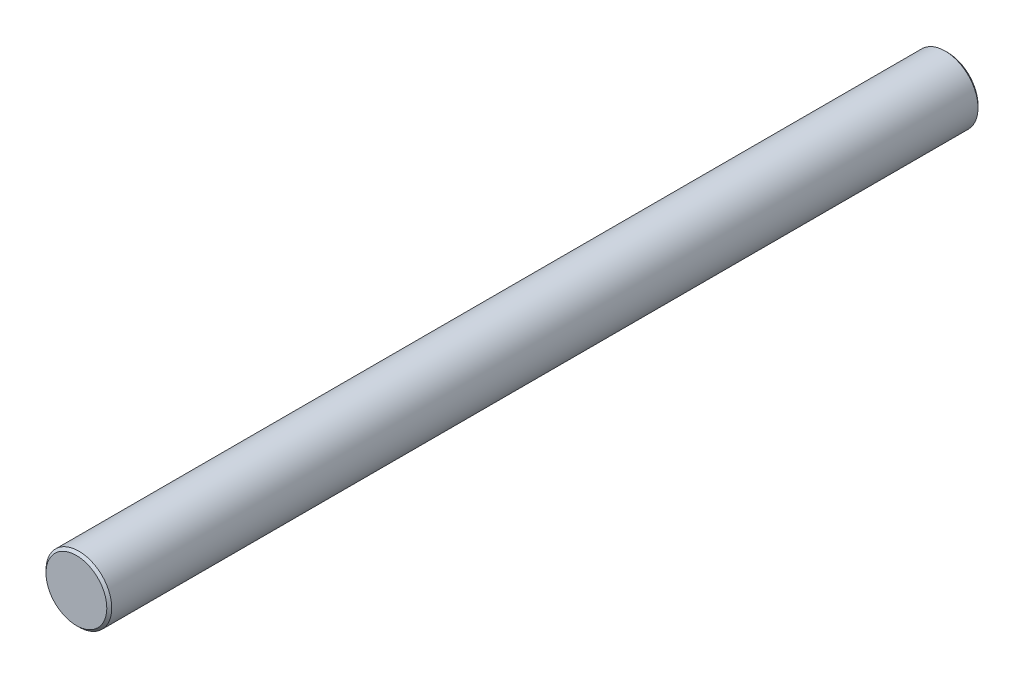
ISO-10303-21;
HEADER;
FILE_DESCRIPTION(('STEP AP214'),'2;1');
FILE_NAME('part.step','',(''),(''),'','','');
FILE_SCHEMA(('AUTOMOTIVE_DESIGN { 1 0 10303 214 1 1 1 1 }'));
ENDSEC;
DATA;
#1=APPLICATION_CONTEXT('core data for automotive mechanical design processes');
#2=APPLICATION_PROTOCOL_DEFINITION('international standard','automotive_design',2000,#1);
#3=PRODUCT_CONTEXT('',#1,'mechanical');
#4=PRODUCT('Part','Part','',(#3));
#5=PRODUCT_RELATED_PRODUCT_CATEGORY('part','',(#4));
#6=PRODUCT_DEFINITION_FORMATION('','',#4);
#7=PRODUCT_DEFINITION_CONTEXT('part definition',#1,'design');
#8=PRODUCT_DEFINITION('design','',#6,#7);
#9=PRODUCT_DEFINITION_SHAPE('','',#8);
#10=(LENGTH_UNIT() NAMED_UNIT(*) SI_UNIT(.MILLI.,.METRE.));
#11=(NAMED_UNIT(*) PLANE_ANGLE_UNIT() SI_UNIT($,.RADIAN.));
#12=(NAMED_UNIT(*) SI_UNIT($,.STERADIAN.) SOLID_ANGLE_UNIT());
#13=UNCERTAINTY_MEASURE_WITH_UNIT(LENGTH_MEASURE(1.E-05),#10,'distance_accuracy_value','');
#14=(GEOMETRIC_REPRESENTATION_CONTEXT(3) GLOBAL_UNCERTAINTY_ASSIGNED_CONTEXT((#13)) GLOBAL_UNIT_ASSIGNED_CONTEXT((#10,
#11,#12)) REPRESENTATION_CONTEXT('',''));
#15=CARTESIAN_POINT('',(0.,0.,0.));
#16=DIRECTION('',(0.,0.,1.));
#17=DIRECTION('',(1.,0.,0.));
#18=AXIS2_PLACEMENT_3D('',#15,#16,#17);
#19=CARTESIAN_POINT('',(0.,9.25,0.));
#20=DIRECTION('',(0.,0.,-1.));
#21=DIRECTION('',(0.,1.,0.));
#22=AXIS2_PLACEMENT_3D('',#19,#20,#21);
#23=PLANE('',#22);
#24=CARTESIAN_POINT('',(0.,0.,0.));
#25=DIRECTION('',(0.,0.,-1.));
#26=DIRECTION('',(0.,1.,0.));
#27=AXIS2_PLACEMENT_3D('',#24,#25,#26);
#28=CIRCLE('',#27,18.5);
#29=CARTESIAN_POINT('',(0.,18.5,0.));
#30=VERTEX_POINT('',#29);
#31=EDGE_CURVE('E9',#30,#30,#28,.T.);
#32=ORIENTED_EDGE('',*,*,#31,.T.);
#33=EDGE_LOOP('',(#32));
#34=FACE_BOUND('',#33,.T.);
#35=CARTESIAN_POINT('',(0.,0.,0.));
#36=DIRECTION('',(0.,0.,1.));
#37=DIRECTION('',(-1.,0.,0.));
#38=AXIS2_PLACEMENT_3D('',#35,#36,#37);
#39=CIRCLE('',#38,6.);
#40=CARTESIAN_POINT('',(-6.,0.,0.));
#41=VERTEX_POINT('',#40);
#42=EDGE_CURVE('E52',#41,#41,#39,.T.);
#43=ORIENTED_EDGE('',*,*,#42,.T.);
#44=EDGE_LOOP('',(#43));
#45=FACE_BOUND('',#44,.T.);
#46=ADVANCED_FACE('F15',(#34,#45),#23,.T.);
#47=CARTESIAN_POINT('',(0.,0.,0.75));
#48=DIRECTION('',(0.,0.,1.));
#49=DIRECTION('',(0.,1.,0.));
#50=AXIS2_PLACEMENT_3D('',#47,#48,#49);
#51=CONICAL_SURFACE('',#50,19.25,0.785398163397448);
#52=CARTESIAN_POINT('',(0.,0.,1.5));
#53=DIRECTION('',(0.,0.,-1.));
#54=DIRECTION('',(0.,1.,0.));
#55=AXIS2_PLACEMENT_3D('',#52,#53,#54);
#56=CIRCLE('',#55,20.);
#57=CARTESIAN_POINT('',(0.,20.,1.5));
#58=VERTEX_POINT('',#57);
#59=EDGE_CURVE('E25',#58,#58,#56,.T.);
#60=ORIENTED_EDGE('',*,*,#59,.T.);
#61=EDGE_LOOP('',(#60));
#62=FACE_BOUND('',#61,.T.);
#63=ORIENTED_EDGE('',*,*,#31,.F.);
#64=EDGE_LOOP('',(#63));
#65=FACE_BOUND('',#64,.T.);
#66=ADVANCED_FACE('F121',(#62,#65),#51,.T.);
#67=CARTESIAN_POINT('',(0.,0.,265.));
#68=DIRECTION('',(0.,0.,1.));
#69=DIRECTION('',(0.,1.,0.));
#70=AXIS2_PLACEMENT_3D('',#67,#68,#69);
#71=CYLINDRICAL_SURFACE('',#70,20.);
#72=CARTESIAN_POINT('',(0.,0.,528.5));
#73=DIRECTION('',(0.,0.,-1.));
#74=DIRECTION('',(0.,1.,0.));
#75=AXIS2_PLACEMENT_3D('',#72,#73,#74);
#76=CIRCLE('',#75,20.);
#77=CARTESIAN_POINT('',(0.,20.,528.5));
#78=VERTEX_POINT('',#77);
#79=EDGE_CURVE('E19',#78,#78,#76,.T.);
#80=ORIENTED_EDGE('',*,*,#79,.T.);
#81=EDGE_LOOP('',(#80));
#82=FACE_BOUND('',#81,.T.);
#83=ORIENTED_EDGE('',*,*,#59,.F.);
#84=EDGE_LOOP('',(#83));
#85=FACE_BOUND('',#84,.T.);
#86=CARTESIAN_POINT('',(0.,0.,6.5));
#87=DIRECTION('',(0.,0.,-1.));
#88=DIRECTION('',(0.,1.,0.));
#89=AXIS2_PLACEMENT_3D('',#86,#87,#88);
#90=CIRCLE('',#89,20.);
#91=CARTESIAN_POINT('',(10.5356537528527,-17.,6.5));
#92=VERTEX_POINT('',#91);
#93=CARTESIAN_POINT('',(-10.5356537528527,-17.,6.5));
#94=VERTEX_POINT('',#93);
#95=EDGE_CURVE('E69',#92,#94,#90,.T.);
#96=ORIENTED_EDGE('',*,*,#95,.T.);
#97=DIRECTION('',(0.,0.,1.));
#98=VECTOR('',#97,1.);
#99=CARTESIAN_POINT('',(-10.5356537528527,-17.,8.25));
#100=LINE('',#99,#98);
#101=CARTESIAN_POINT('',(-10.5356537528527,-17.,10.));
#102=VERTEX_POINT('',#101);
#103=EDGE_CURVE('E62',#94,#102,#100,.T.);
#104=ORIENTED_EDGE('',*,*,#103,.T.);
#105=CARTESIAN_POINT('',(0.,0.,10.));
#106=DIRECTION('',(0.,0.,1.));
#107=DIRECTION('',(0.,1.,0.));
#108=AXIS2_PLACEMENT_3D('',#105,#106,#107);
#109=CIRCLE('',#108,20.);
#110=CARTESIAN_POINT('',(10.5356537528527,-17.,10.));
#111=VERTEX_POINT('',#110);
#112=EDGE_CURVE('E75',#102,#111,#109,.T.);
#113=ORIENTED_EDGE('',*,*,#112,.T.);
#114=DIRECTION('',(0.,0.,-1.));
#115=VECTOR('',#114,1.);
#116=CARTESIAN_POINT('',(10.5356537528527,-17.,8.25));
#117=LINE('',#116,#115);
#118=EDGE_CURVE('E60',#111,#92,#117,.T.);
#119=ORIENTED_EDGE('',*,*,#118,.T.);
#120=EDGE_LOOP('',(#96,#104,#113,#119));
#121=FACE_BOUND('',#120,.T.);
#122=ADVANCED_FACE('F17',(#82,#85,#121),#71,.T.);
#123=CARTESIAN_POINT('',(0.,0.,529.25));
#124=DIRECTION('',(0.,0.,-1.));
#125=DIRECTION('',(0.,1.,0.));
#126=AXIS2_PLACEMENT_3D('',#123,#124,#125);
#127=CONICAL_SURFACE('',#126,19.25,0.785398163397448);
#128=CARTESIAN_POINT('',(0.,0.,530.));
#129=DIRECTION('',(0.,0.,-1.));
#130=DIRECTION('',(0.,1.,0.));
#131=AXIS2_PLACEMENT_3D('',#128,#129,#130);
#132=CIRCLE('',#131,18.5);
#133=CARTESIAN_POINT('',(0.,18.5,530.));
#134=VERTEX_POINT('',#133);
#135=EDGE_CURVE('E44',#134,#134,#132,.T.);
#136=ORIENTED_EDGE('',*,*,#135,.T.);
#137=EDGE_LOOP('',(#136));
#138=FACE_BOUND('',#137,.T.);
#139=ORIENTED_EDGE('',*,*,#79,.F.);
#140=EDGE_LOOP('',(#139));
#141=FACE_BOUND('',#140,.T.);
#142=ADVANCED_FACE('F116',(#138,#141),#127,.T.);
#143=CARTESIAN_POINT('',(0.,9.25,530.));
#144=DIRECTION('',(0.,0.,1.));
#145=DIRECTION('',(0.,-1.,0.));
#146=AXIS2_PLACEMENT_3D('',#143,#144,#145);
#147=PLANE('',#146);
#148=ORIENTED_EDGE('',*,*,#135,.F.);
#149=EDGE_LOOP('',(#148));
#150=FACE_BOUND('',#149,.T.);
#151=ADVANCED_FACE('F110',(#150),#147,.T.);
#152=CARTESIAN_POINT('',(0.,0.,26.4586213285198));
#153=DIRECTION('',(0.,0.,-1.));
#154=DIRECTION('',(-1.,0.,0.));
#155=AXIS2_PLACEMENT_3D('',#152,#153,#154);
#156=CONICAL_SURFACE('',#155,2.52640625,1.0471975511966);
#157=CARTESIAN_POINT('',(0.,0.,25.));
#158=DIRECTION('',(0.,0.,1.));
#159=DIRECTION('',(-1.,0.,0.));
#160=AXIS2_PLACEMENT_3D('',#157,#158,#159);
#161=CIRCLE('',#160,5.0528125);
#162=CARTESIAN_POINT('',(-5.0528125,0.,25.));
#163=VERTEX_POINT('',#162);
#164=EDGE_CURVE('E51',#163,#163,#161,.T.);
#165=ORIENTED_EDGE('',*,*,#164,.F.);
#166=EDGE_LOOP('',(#165));
#167=FACE_BOUND('',#166,.T.);
#168=CARTESIAN_POINT('',(0.,0.,27.9172426570397));
#169=VERTEX_POINT('',#168);
#170=VERTEX_LOOP('',#169);
#171=FACE_BOUND('',#170,.T.);
#172=ADVANCED_FACE('F104',(#167,#171),#156,.F.);
#173=CARTESIAN_POINT('',(0.,0.,12.97359375));
#174=DIRECTION('',(0.,0.,-1.));
#175=DIRECTION('',(-1.,0.,0.));
#176=AXIS2_PLACEMENT_3D('',#173,#174,#175);
#177=CYLINDRICAL_SURFACE('',#176,5.0528125);
#178=CARTESIAN_POINT('',(0.,0.,0.9471875));
#179=DIRECTION('',(0.,0.,1.));
#180=DIRECTION('',(-1.,0.,0.));
#181=AXIS2_PLACEMENT_3D('',#178,#179,#180);
#182=CIRCLE('',#181,5.0528125);
#183=CARTESIAN_POINT('',(-5.0528125,0.,0.9471875));
#184=VERTEX_POINT('',#183);
#185=EDGE_CURVE('E57',#184,#184,#182,.T.);
#186=ORIENTED_EDGE('',*,*,#185,.F.);
#187=EDGE_LOOP('',(#186));
#188=FACE_BOUND('',#187,.T.);
#189=ORIENTED_EDGE('',*,*,#164,.T.);
#190=EDGE_LOOP('',(#189));
#191=FACE_BOUND('',#190,.T.);
#192=ADVANCED_FACE('F101',(#188,#191),#177,.F.);
#193=CARTESIAN_POINT('',(0.,0.,0.47359375));
#194=DIRECTION('',(0.,0.,-1.));
#195=DIRECTION('',(-1.,0.,0.));
#196=AXIS2_PLACEMENT_3D('',#193,#194,#195);
#197=CONICAL_SURFACE('',#196,5.52640625,0.785398163397448);
#198=ORIENTED_EDGE('',*,*,#42,.F.);
#199=EDGE_LOOP('',(#198));
#200=FACE_BOUND('',#199,.T.);
#201=ORIENTED_EDGE('',*,*,#185,.T.);
#202=EDGE_LOOP('',(#201));
#203=FACE_BOUND('',#202,.T.);
#204=ADVANCED_FACE('F99',(#200,#203),#197,.F.);
#205=CARTESIAN_POINT('',(0.,-17.,8.25));
#206=DIRECTION('',(0.,-1.,0.));
#207=DIRECTION('',(0.,0.,-1.));
#208=AXIS2_PLACEMENT_3D('',#205,#206,#207);
#209=PLANE('',#208);
#210=ORIENTED_EDGE('',*,*,#103,.F.);
#211=DIRECTION('',(1.,0.,0.));
#212=VECTOR('',#211,1.);
#213=CARTESIAN_POINT('',(0.,-17.,6.5));
#214=LINE('',#213,#212);
#215=EDGE_CURVE('E66',#94,#92,#214,.T.);
#216=ORIENTED_EDGE('',*,*,#215,.T.);
#217=ORIENTED_EDGE('',*,*,#118,.F.);
#218=DIRECTION('',(-1.,0.,0.));
#219=VECTOR('',#218,1.);
#220=CARTESIAN_POINT('',(0.,-17.,10.));
#221=LINE('',#220,#219);
#222=EDGE_CURVE('E72',#111,#102,#221,.T.);
#223=ORIENTED_EDGE('',*,*,#222,.T.);
#224=EDGE_LOOP('',(#210,#216,#217,#223));
#225=FACE_BOUND('',#224,.T.);
#226=ADVANCED_FACE('F131',(#225),#209,.T.);
#227=CARTESIAN_POINT('',(0.,-19.5,6.5));
#228=DIRECTION('',(0.,0.,1.));
#229=DIRECTION('',(1.,0.,0.));
#230=AXIS2_PLACEMENT_3D('',#227,#228,#229);
#231=PLANE('',#230);
#232=ORIENTED_EDGE('',*,*,#95,.F.);
#233=ORIENTED_EDGE('',*,*,#215,.F.);
#234=EDGE_LOOP('',(#232,#233));
#235=FACE_BOUND('',#234,.T.);
#236=ADVANCED_FACE('F135',(#235),#231,.T.);
#237=CARTESIAN_POINT('',(0.,-19.5,10.));
#238=DIRECTION('',(0.,0.,1.));
#239=DIRECTION('',(1.,0.,0.));
#240=AXIS2_PLACEMENT_3D('',#237,#238,#239);
#241=PLANE('',#240);
#242=ORIENTED_EDGE('',*,*,#112,.F.);
#243=ORIENTED_EDGE('',*,*,#222,.F.);
#244=EDGE_LOOP('',(#242,#243));
#245=FACE_BOUND('',#244,.T.);
#246=ADVANCED_FACE('F87',(#245),#241,.F.);
#247=CLOSED_SHELL('',(#46,#66,#122,#142,#151,#172,#192,#204,#226,#236,#246));
#248=MANIFOLD_SOLID_BREP('B1',#247);
#249=ADVANCED_BREP_SHAPE_REPRESENTATION('',(#18,#248),#14);
#250=SHAPE_DEFINITION_REPRESENTATION(#9,#249);
ENDSEC;
END-ISO-10303-21;
